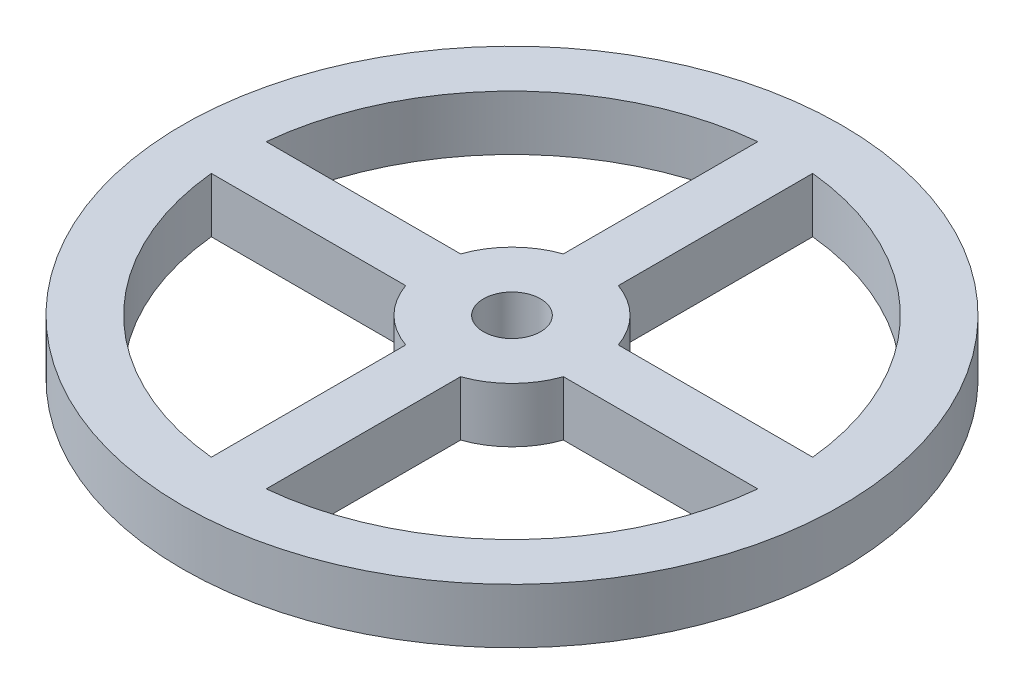
ISO-10303-21;
HEADER;
FILE_DESCRIPTION(('STEP AP214'),'2;1');
FILE_NAME('part.step','',(''),(''),'','','');
FILE_SCHEMA(('AUTOMOTIVE_DESIGN { 1 0 10303 214 1 1 1 1 }'));
ENDSEC;
DATA;
#1=APPLICATION_CONTEXT('core data for automotive mechanical design processes');
#2=APPLICATION_PROTOCOL_DEFINITION('international standard','automotive_design',2000,#1);
#3=PRODUCT_CONTEXT('',#1,'mechanical');
#4=PRODUCT('Part','Part','',(#3));
#5=PRODUCT_RELATED_PRODUCT_CATEGORY('part','',(#4));
#6=PRODUCT_DEFINITION_FORMATION('','',#4);
#7=PRODUCT_DEFINITION_CONTEXT('part definition',#1,'design');
#8=PRODUCT_DEFINITION('design','',#6,#7);
#9=PRODUCT_DEFINITION_SHAPE('','',#8);
#10=(LENGTH_UNIT() NAMED_UNIT(*) SI_UNIT(.MILLI.,.METRE.));
#11=(NAMED_UNIT(*) PLANE_ANGLE_UNIT() SI_UNIT($,.RADIAN.));
#12=(NAMED_UNIT(*) SI_UNIT($,.STERADIAN.) SOLID_ANGLE_UNIT());
#13=UNCERTAINTY_MEASURE_WITH_UNIT(LENGTH_MEASURE(1.E-05),#10,'distance_accuracy_value','');
#14=(GEOMETRIC_REPRESENTATION_CONTEXT(3) GLOBAL_UNCERTAINTY_ASSIGNED_CONTEXT((#13)) GLOBAL_UNIT_ASSIGNED_CONTEXT((#10,
#11,#12)) REPRESENTATION_CONTEXT('',''));
#15=CARTESIAN_POINT('',(0.,0.,0.));
#16=DIRECTION('',(0.,0.,1.));
#17=DIRECTION('',(1.,0.,0.));
#18=AXIS2_PLACEMENT_3D('',#15,#16,#17);
#19=CARTESIAN_POINT('',(0.,6.35,0.));
#20=DIRECTION('',(0.,1.,0.));
#21=DIRECTION('',(0.,0.,1.));
#22=AXIS2_PLACEMENT_3D('',#19,#20,#21);
#23=PLANE('',#22);
#24=CARTESIAN_POINT('',(0.,6.35,0.));
#25=DIRECTION('',(0.,1.,0.));
#26=DIRECTION('',(0.,0.,1.));
#27=AXIS2_PLACEMENT_3D('',#24,#25,#26);
#28=CIRCLE('',#27,38.1);
#29=CARTESIAN_POINT('',(0.,6.35,38.1));
#30=VERTEX_POINT('',#29);
#31=EDGE_CURVE('E11',#30,#30,#28,.T.);
#32=ORIENTED_EDGE('',*,*,#31,.T.);
#33=EDGE_LOOP('',(#32));
#34=FACE_BOUND('',#33,.T.);
#35=CARTESIAN_POINT('',(0.,6.35,0.));
#36=DIRECTION('',(0.,1.,0.));
#37=DIRECTION('',(0.,0.,1.));
#38=AXIS2_PLACEMENT_3D('',#35,#36,#37);
#39=CIRCLE('',#38,3.302);
#40=CARTESIAN_POINT('',(0.,6.35,3.302));
#41=VERTEX_POINT('',#40);
#42=EDGE_CURVE('E336',#41,#41,#39,.T.);
#43=ORIENTED_EDGE('',*,*,#42,.F.);
#44=EDGE_LOOP('',(#43));
#45=FACE_BOUND('',#44,.T.);
#46=DIRECTION('',(1.,0.,0.));
#47=VECTOR('',#46,1.);
#48=CARTESIAN_POINT('',(-31.5908511281352,6.35,-3.17499999999999));
#49=LINE('',#48,#47);
#50=CARTESIAN_POINT('',(-31.5908511281352,6.35,-3.17499999999999));
#51=VERTEX_POINT('',#50);
#52=CARTESIAN_POINT('',(-9.11484936792704,6.35,-3.175));
#53=VERTEX_POINT('',#52);
#54=EDGE_CURVE('E295',#51,#53,#49,.T.);
#55=ORIENTED_EDGE('',*,*,#54,.F.);
#56=CARTESIAN_POINT('',(0.,6.35,0.));
#57=DIRECTION('',(0.,1.,0.));
#58=DIRECTION('',(0.,0.,1.));
#59=AXIS2_PLACEMENT_3D('',#56,#57,#58);
#60=CIRCLE('',#59,31.75);
#61=CARTESIAN_POINT('',(-3.175,6.35,-31.5908511281352));
#62=VERTEX_POINT('',#61);
#63=EDGE_CURVE('E292',#62,#51,#60,.T.);
#64=ORIENTED_EDGE('',*,*,#63,.F.);
#65=DIRECTION('',(0.,0.,1.));
#66=VECTOR('',#65,1.);
#67=CARTESIAN_POINT('',(-3.175,6.35,-31.5908511281352));
#68=LINE('',#67,#66);
#69=CARTESIAN_POINT('',(-3.175,6.35,-9.11484936792704));
#70=VERTEX_POINT('',#69);
#71=EDGE_CURVE('E303',#62,#70,#68,.T.);
#72=ORIENTED_EDGE('',*,*,#71,.T.);
#73=CARTESIAN_POINT('',(0.,6.35,0.));
#74=DIRECTION('',(0.,1.,0.));
#75=DIRECTION('',(0.,0.,1.));
#76=AXIS2_PLACEMENT_3D('',#73,#74,#75);
#77=CIRCLE('',#76,9.652);
#78=EDGE_CURVE('E299',#70,#53,#77,.T.);
#79=ORIENTED_EDGE('',*,*,#78,.T.);
#80=EDGE_LOOP('',(#55,#64,#72,#79));
#81=FACE_BOUND('',#80,.T.);
#82=DIRECTION('',(0.,0.,-1.));
#83=VECTOR('',#82,1.);
#84=CARTESIAN_POINT('',(-3.17500000000033,6.35,31.5908511281352));
#85=LINE('',#84,#83);
#86=CARTESIAN_POINT('',(-3.17500000000033,6.35,31.5908511281352));
#87=VERTEX_POINT('',#86);
#88=CARTESIAN_POINT('',(-3.1750000000001,6.35,9.11484936792701));
#89=VERTEX_POINT('',#88);
#90=EDGE_CURVE('E281',#87,#89,#85,.T.);
#91=ORIENTED_EDGE('',*,*,#90,.F.);
#92=CARTESIAN_POINT('',(0.,6.35,0.));
#93=DIRECTION('',(0.,1.,0.));
#94=DIRECTION('',(1.,0.,0.));
#95=AXIS2_PLACEMENT_3D('',#92,#93,#94);
#96=CIRCLE('',#95,31.75);
#97=CARTESIAN_POINT('',(-31.5908511281352,6.35,3.17499999999967));
#98=VERTEX_POINT('',#97);
#99=EDGE_CURVE('E208',#98,#87,#96,.T.);
#100=ORIENTED_EDGE('',*,*,#99,.F.);
#101=DIRECTION('',(1.,0.,0.));
#102=VECTOR('',#101,1.);
#103=CARTESIAN_POINT('',(-31.5908511281352,6.35,3.17499999999967));
#104=LINE('',#103,#102);
#105=CARTESIAN_POINT('',(-9.11484936792708,6.35,3.1749999999999));
#106=VERTEX_POINT('',#105);
#107=EDGE_CURVE('E250',#98,#106,#104,.T.);
#108=ORIENTED_EDGE('',*,*,#107,.T.);
#109=CARTESIAN_POINT('',(0.,6.35,0.));
#110=DIRECTION('',(0.,1.,0.));
#111=DIRECTION('',(1.,0.,0.));
#112=AXIS2_PLACEMENT_3D('',#109,#110,#111);
#113=CIRCLE('',#112,9.652);
#114=EDGE_CURVE('E269',#106,#89,#113,.T.);
#115=ORIENTED_EDGE('',*,*,#114,.T.);
#116=EDGE_LOOP('',(#91,#100,#108,#115));
#117=FACE_BOUND('',#116,.T.);
#118=DIRECTION('',(-1.,0.,0.));
#119=VECTOR('',#118,1.);
#120=CARTESIAN_POINT('',(31.5908511281352,6.35,3.17499999999999));
#121=LINE('',#120,#119);
#122=CARTESIAN_POINT('',(31.5908511281352,6.35,3.17499999999999));
#123=VERTEX_POINT('',#122);
#124=CARTESIAN_POINT('',(9.11484936792704,6.35,3.175));
#125=VERTEX_POINT('',#124);
#126=EDGE_CURVE('E236',#123,#125,#121,.T.);
#127=ORIENTED_EDGE('',*,*,#126,.F.);
#128=CARTESIAN_POINT('',(0.,6.35,0.));
#129=DIRECTION('',(0.,1.,0.));
#130=DIRECTION('',(0.,0.,-1.));
#131=AXIS2_PLACEMENT_3D('',#128,#129,#130);
#132=CIRCLE('',#131,31.75);
#133=CARTESIAN_POINT('',(3.175,6.35,31.5908511281352));
#134=VERTEX_POINT('',#133);
#135=EDGE_CURVE('E166',#134,#123,#132,.T.);
#136=ORIENTED_EDGE('',*,*,#135,.F.);
#137=DIRECTION('',(0.,0.,-1.));
#138=VECTOR('',#137,1.);
#139=CARTESIAN_POINT('',(3.175,6.35,31.5908511281352));
#140=LINE('',#139,#138);
#141=CARTESIAN_POINT('',(3.175,6.35,9.11484936792704));
#142=VERTEX_POINT('',#141);
#143=EDGE_CURVE('E207',#134,#142,#140,.T.);
#144=ORIENTED_EDGE('',*,*,#143,.T.);
#145=CARTESIAN_POINT('',(0.,6.35,0.));
#146=DIRECTION('',(0.,1.,0.));
#147=DIRECTION('',(0.,0.,-1.));
#148=AXIS2_PLACEMENT_3D('',#145,#146,#147);
#149=CIRCLE('',#148,9.652);
#150=EDGE_CURVE('E63',#142,#125,#149,.T.);
#151=ORIENTED_EDGE('',*,*,#150,.T.);
#152=EDGE_LOOP('',(#127,#136,#144,#151));
#153=FACE_BOUND('',#152,.T.);
#154=DIRECTION('',(0.,0.,1.));
#155=VECTOR('',#154,1.);
#156=CARTESIAN_POINT('',(3.1750000000001,6.35,-31.5908511281352));
#157=LINE('',#156,#155);
#158=CARTESIAN_POINT('',(3.1750000000001,6.35,-31.5908511281352));
#159=VERTEX_POINT('',#158);
#160=CARTESIAN_POINT('',(3.17500000000004,6.35,-9.11484936792703));
#161=VERTEX_POINT('',#160);
#162=EDGE_CURVE('E192',#159,#161,#157,.T.);
#163=ORIENTED_EDGE('',*,*,#162,.F.);
#164=CARTESIAN_POINT('',(0.,6.35,0.));
#165=DIRECTION('',(0.,1.,0.));
#166=DIRECTION('',(-1.,0.,0.));
#167=AXIS2_PLACEMENT_3D('',#164,#165,#166);
#168=CIRCLE('',#167,31.75);
#169=CARTESIAN_POINT('',(31.5908511281352,6.35,-3.17499999999989));
#170=VERTEX_POINT('',#169);
#171=EDGE_CURVE('E199',#170,#159,#168,.T.);
#172=ORIENTED_EDGE('',*,*,#171,.F.);
#173=DIRECTION('',(-1.,0.,0.));
#174=VECTOR('',#173,1.);
#175=CARTESIAN_POINT('',(31.5908511281352,6.35,-3.17499999999989));
#176=LINE('',#175,#174);
#177=CARTESIAN_POINT('',(9.11484936792705,6.35,-3.17499999999996));
#178=VERTEX_POINT('',#177);
#179=EDGE_CURVE('E165',#170,#178,#176,.T.);
#180=ORIENTED_EDGE('',*,*,#179,.T.);
#181=CARTESIAN_POINT('',(0.,6.35,0.));
#182=DIRECTION('',(0.,1.,0.));
#183=DIRECTION('',(-1.,0.,0.));
#184=AXIS2_PLACEMENT_3D('',#181,#182,#183);
#185=CIRCLE('',#184,9.652);
#186=EDGE_CURVE('E55',#178,#161,#185,.T.);
#187=ORIENTED_EDGE('',*,*,#186,.T.);
#188=EDGE_LOOP('',(#163,#172,#180,#187));
#189=FACE_BOUND('',#188,.T.);
#190=ADVANCED_FACE('F39',(#34,#45,#81,#117,#153,#189),#23,.T.);
#191=CARTESIAN_POINT('',(0.,0.,0.));
#192=DIRECTION('',(0.,1.,0.));
#193=DIRECTION('',(0.,0.,1.));
#194=AXIS2_PLACEMENT_3D('',#191,#192,#193);
#195=PLANE('',#194);
#196=CARTESIAN_POINT('',(0.,0.,0.));
#197=DIRECTION('',(0.,1.,0.));
#198=DIRECTION('',(0.,0.,-1.));
#199=AXIS2_PLACEMENT_3D('',#196,#197,#198);
#200=CIRCLE('',#199,31.75);
#201=CARTESIAN_POINT('',(3.175,0.,31.5908511281352));
#202=VERTEX_POINT('',#201);
#203=CARTESIAN_POINT('',(31.5908511281352,0.,3.17499999999999));
#204=VERTEX_POINT('',#203);
#205=EDGE_CURVE('E240',#202,#204,#200,.T.);
#206=ORIENTED_EDGE('',*,*,#205,.T.);
#207=DIRECTION('',(-1.,0.,0.));
#208=VECTOR('',#207,1.);
#209=CARTESIAN_POINT('',(31.5908511281352,0.,3.17499999999999));
#210=LINE('',#209,#208);
#211=CARTESIAN_POINT('',(9.11484936792704,0.,3.175));
#212=VERTEX_POINT('',#211);
#213=EDGE_CURVE('E228',#204,#212,#210,.T.);
#214=ORIENTED_EDGE('',*,*,#213,.T.);
#215=CARTESIAN_POINT('',(0.,0.,0.));
#216=DIRECTION('',(0.,1.,0.));
#217=DIRECTION('',(0.,0.,-1.));
#218=AXIS2_PLACEMENT_3D('',#215,#216,#217);
#219=CIRCLE('',#218,9.652);
#220=CARTESIAN_POINT('',(3.175,0.,9.11484936792704));
#221=VERTEX_POINT('',#220);
#222=EDGE_CURVE('E219',#221,#212,#219,.T.);
#223=ORIENTED_EDGE('',*,*,#222,.F.);
#224=DIRECTION('',(0.,0.,-1.));
#225=VECTOR('',#224,1.);
#226=CARTESIAN_POINT('',(3.175,0.,31.5908511281352));
#227=LINE('',#226,#225);
#228=EDGE_CURVE('E204',#202,#221,#227,.T.);
#229=ORIENTED_EDGE('',*,*,#228,.F.);
#230=EDGE_LOOP('',(#206,#214,#223,#229));
#231=FACE_BOUND('',#230,.T.);
#232=CARTESIAN_POINT('',(0.,0.,0.));
#233=DIRECTION('',(0.,1.,0.));
#234=DIRECTION('',(0.,0.,1.));
#235=AXIS2_PLACEMENT_3D('',#232,#233,#234);
#236=CIRCLE('',#235,31.75);
#237=CARTESIAN_POINT('',(-3.175,0.,-31.5908511281352));
#238=VERTEX_POINT('',#237);
#239=CARTESIAN_POINT('',(-31.5908511281352,0.,-3.17499999999999));
#240=VERTEX_POINT('',#239);
#241=EDGE_CURVE('E203',#238,#240,#236,.T.);
#242=ORIENTED_EDGE('',*,*,#241,.T.);
#243=DIRECTION('',(1.,0.,0.));
#244=VECTOR('',#243,1.);
#245=CARTESIAN_POINT('',(-31.5908511281352,0.,-3.17499999999999));
#246=LINE('',#245,#244);
#247=CARTESIAN_POINT('',(-9.11484936792704,0.,-3.175));
#248=VERTEX_POINT('',#247);
#249=EDGE_CURVE('E311',#240,#248,#246,.T.);
#250=ORIENTED_EDGE('',*,*,#249,.T.);
#251=CARTESIAN_POINT('',(0.,0.,0.));
#252=DIRECTION('',(0.,1.,0.));
#253=DIRECTION('',(0.,0.,1.));
#254=AXIS2_PLACEMENT_3D('',#251,#252,#253);
#255=CIRCLE('',#254,9.652);
#256=CARTESIAN_POINT('',(-3.175,0.,-9.11484936792704));
#257=VERTEX_POINT('',#256);
#258=EDGE_CURVE('E315',#257,#248,#255,.T.);
#259=ORIENTED_EDGE('',*,*,#258,.F.);
#260=DIRECTION('',(0.,0.,1.));
#261=VECTOR('',#260,1.);
#262=CARTESIAN_POINT('',(-3.175,0.,-31.5908511281352));
#263=LINE('',#262,#261);
#264=EDGE_CURVE('E296',#238,#257,#263,.T.);
#265=ORIENTED_EDGE('',*,*,#264,.F.);
#266=EDGE_LOOP('',(#242,#250,#259,#265));
#267=FACE_BOUND('',#266,.T.);
#268=CARTESIAN_POINT('',(0.,0.,0.));
#269=DIRECTION('',(0.,1.,0.));
#270=DIRECTION('',(0.,0.,1.));
#271=AXIS2_PLACEMENT_3D('',#268,#269,#270);
#272=CIRCLE('',#271,38.1);
#273=CARTESIAN_POINT('',(0.,0.,38.1));
#274=VERTEX_POINT('',#273);
#275=EDGE_CURVE('E43',#274,#274,#272,.T.);
#276=ORIENTED_EDGE('',*,*,#275,.F.);
#277=EDGE_LOOP('',(#276));
#278=FACE_BOUND('',#277,.T.);
#279=CARTESIAN_POINT('',(0.,0.,0.));
#280=DIRECTION('',(0.,1.,0.));
#281=DIRECTION('',(0.,0.,1.));
#282=AXIS2_PLACEMENT_3D('',#279,#280,#281);
#283=CIRCLE('',#282,3.302);
#284=CARTESIAN_POINT('',(0.,0.,3.302));
#285=VERTEX_POINT('',#284);
#286=EDGE_CURVE('E335',#285,#285,#283,.T.);
#287=ORIENTED_EDGE('',*,*,#286,.T.);
#288=EDGE_LOOP('',(#287));
#289=FACE_BOUND('',#288,.T.);
#290=CARTESIAN_POINT('',(0.,0.,0.));
#291=DIRECTION('',(0.,1.,0.));
#292=DIRECTION('',(1.,0.,0.));
#293=AXIS2_PLACEMENT_3D('',#290,#291,#292);
#294=CIRCLE('',#293,31.75);
#295=CARTESIAN_POINT('',(-31.5908511281352,0.,3.17499999999967));
#296=VERTEX_POINT('',#295);
#297=CARTESIAN_POINT('',(-3.17500000000033,0.,31.5908511281352));
#298=VERTEX_POINT('',#297);
#299=EDGE_CURVE('E285',#296,#298,#294,.T.);
#300=ORIENTED_EDGE('',*,*,#299,.T.);
#301=DIRECTION('',(0.,0.,-1.));
#302=VECTOR('',#301,1.);
#303=CARTESIAN_POINT('',(-3.17500000000033,0.,31.5908511281352));
#304=LINE('',#303,#302);
#305=CARTESIAN_POINT('',(-3.1750000000001,0.,9.11484936792701));
#306=VERTEX_POINT('',#305);
#307=EDGE_CURVE('E273',#298,#306,#304,.T.);
#308=ORIENTED_EDGE('',*,*,#307,.T.);
#309=CARTESIAN_POINT('',(0.,0.,0.));
#310=DIRECTION('',(0.,1.,0.));
#311=DIRECTION('',(1.,0.,0.));
#312=AXIS2_PLACEMENT_3D('',#309,#310,#311);
#313=CIRCLE('',#312,9.652);
#314=CARTESIAN_POINT('',(-9.11484936792708,0.,3.1749999999999));
#315=VERTEX_POINT('',#314);
#316=EDGE_CURVE('E262',#315,#306,#313,.T.);
#317=ORIENTED_EDGE('',*,*,#316,.F.);
#318=DIRECTION('',(1.,0.,0.));
#319=VECTOR('',#318,1.);
#320=CARTESIAN_POINT('',(-31.5908511281352,0.,3.17499999999967));
#321=LINE('',#320,#319);
#322=EDGE_CURVE('E247',#296,#315,#321,.T.);
#323=ORIENTED_EDGE('',*,*,#322,.F.);
#324=EDGE_LOOP('',(#300,#308,#317,#323));
#325=FACE_BOUND('',#324,.T.);
#326=CARTESIAN_POINT('',(0.,0.,0.));
#327=DIRECTION('',(0.,1.,0.));
#328=DIRECTION('',(-1.,0.,0.));
#329=AXIS2_PLACEMENT_3D('',#326,#327,#328);
#330=CIRCLE('',#329,31.75);
#331=CARTESIAN_POINT('',(31.5908511281352,0.,-3.17499999999989));
#332=VERTEX_POINT('',#331);
#333=CARTESIAN_POINT('',(3.1750000000001,0.,-31.5908511281352));
#334=VERTEX_POINT('',#333);
#335=EDGE_CURVE('E196',#332,#334,#330,.T.);
#336=ORIENTED_EDGE('',*,*,#335,.T.);
#337=DIRECTION('',(0.,0.,1.));
#338=VECTOR('',#337,1.);
#339=CARTESIAN_POINT('',(3.1750000000001,0.,-31.5908511281352));
#340=LINE('',#339,#338);
#341=CARTESIAN_POINT('',(3.17500000000004,0.,-9.11484936792703));
#342=VERTEX_POINT('',#341);
#343=EDGE_CURVE('E175',#334,#342,#340,.T.);
#344=ORIENTED_EDGE('',*,*,#343,.T.);
#345=CARTESIAN_POINT('',(0.,0.,0.));
#346=DIRECTION('',(0.,1.,0.));
#347=DIRECTION('',(-1.,0.,0.));
#348=AXIS2_PLACEMENT_3D('',#345,#346,#347);
#349=CIRCLE('',#348,9.652);
#350=CARTESIAN_POINT('',(9.11484936792705,0.,-3.17499999999996));
#351=VERTEX_POINT('',#350);
#352=EDGE_CURVE('E169',#351,#342,#349,.T.);
#353=ORIENTED_EDGE('',*,*,#352,.F.);
#354=DIRECTION('',(-1.,0.,0.));
#355=VECTOR('',#354,1.);
#356=CARTESIAN_POINT('',(31.5908511281352,0.,-3.17499999999989));
#357=LINE('',#356,#355);
#358=EDGE_CURVE('E155',#332,#351,#357,.T.);
#359=ORIENTED_EDGE('',*,*,#358,.F.);
#360=EDGE_LOOP('',(#336,#344,#353,#359));
#361=FACE_BOUND('',#360,.T.);
#362=ADVANCED_FACE('F174',(#231,#267,#278,#289,#325,#361),#195,.F.);
#363=CARTESIAN_POINT('',(0.,6.35,0.));
#364=DIRECTION('',(0.,-1.,0.));
#365=DIRECTION('',(0.,0.,-1.));
#366=AXIS2_PLACEMENT_3D('',#363,#364,#365);
#367=CYLINDRICAL_SURFACE('',#366,38.1);
#368=ORIENTED_EDGE('',*,*,#31,.F.);
#369=EDGE_LOOP('',(#368));
#370=FACE_BOUND('',#369,.T.);
#371=ORIENTED_EDGE('',*,*,#275,.T.);
#372=EDGE_LOOP('',(#371));
#373=FACE_BOUND('',#372,.T.);
#374=ADVANCED_FACE('F41',(#370,#373),#367,.T.);
#375=CARTESIAN_POINT('',(0.,6.35,0.));
#376=DIRECTION('',(0.,-1.,0.));
#377=DIRECTION('',(0.,0.,-1.));
#378=AXIS2_PLACEMENT_3D('',#375,#376,#377);
#379=CYLINDRICAL_SURFACE('',#378,3.302);
#380=ORIENTED_EDGE('',*,*,#42,.T.);
#381=EDGE_LOOP('',(#380));
#382=FACE_BOUND('',#381,.T.);
#383=ORIENTED_EDGE('',*,*,#286,.F.);
#384=EDGE_LOOP('',(#383));
#385=FACE_BOUND('',#384,.T.);
#386=ADVANCED_FACE('F346',(#382,#385),#379,.F.);
#387=CARTESIAN_POINT('',(0.,6.35,0.));
#388=DIRECTION('',(0.,-1.,0.));
#389=DIRECTION('',(0.,0.,-1.));
#390=AXIS2_PLACEMENT_3D('',#387,#388,#389);
#391=CYLINDRICAL_SURFACE('',#390,31.75);
#392=ORIENTED_EDGE('',*,*,#241,.F.);
#393=DIRECTION('',(0.,-1.,0.));
#394=VECTOR('',#393,1.);
#395=CARTESIAN_POINT('',(-3.175,6.35,-31.5908511281352));
#396=LINE('',#395,#394);
#397=EDGE_CURVE('E307',#62,#238,#396,.T.);
#398=ORIENTED_EDGE('',*,*,#397,.F.);
#399=ORIENTED_EDGE('',*,*,#63,.T.);
#400=DIRECTION('',(0.,-1.,0.));
#401=VECTOR('',#400,1.);
#402=CARTESIAN_POINT('',(-31.5908511281352,6.35,-3.17499999999999));
#403=LINE('',#402,#401);
#404=EDGE_CURVE('E331',#51,#240,#403,.T.);
#405=ORIENTED_EDGE('',*,*,#404,.T.);
#406=EDGE_LOOP('',(#392,#398,#399,#405));
#407=FACE_BOUND('',#406,.T.);
#408=ADVANCED_FACE('F348',(#407),#391,.F.);
#409=CARTESIAN_POINT('',(-31.5908511281352,6.35,-3.17499999999999));
#410=DIRECTION('',(0.,0.,-1.));
#411=DIRECTION('',(-1.,0.,0.));
#412=AXIS2_PLACEMENT_3D('',#409,#410,#411);
#413=PLANE('',#412);
#414=ORIENTED_EDGE('',*,*,#249,.F.);
#415=ORIENTED_EDGE('',*,*,#404,.F.);
#416=ORIENTED_EDGE('',*,*,#54,.T.);
#417=DIRECTION('',(0.,-1.,0.));
#418=VECTOR('',#417,1.);
#419=CARTESIAN_POINT('',(-9.11484936792704,6.35,-3.175));
#420=LINE('',#419,#418);
#421=EDGE_CURVE('E328',#53,#248,#420,.T.);
#422=ORIENTED_EDGE('',*,*,#421,.T.);
#423=EDGE_LOOP('',(#414,#415,#416,#422));
#424=FACE_BOUND('',#423,.T.);
#425=ADVANCED_FACE('F355',(#424),#413,.T.);
#426=CARTESIAN_POINT('',(0.,6.35,0.));
#427=DIRECTION('',(0.,-1.,0.));
#428=DIRECTION('',(0.,0.,-1.));
#429=AXIS2_PLACEMENT_3D('',#426,#427,#428);
#430=CYLINDRICAL_SURFACE('',#429,9.652);
#431=ORIENTED_EDGE('',*,*,#258,.T.);
#432=ORIENTED_EDGE('',*,*,#421,.F.);
#433=ORIENTED_EDGE('',*,*,#78,.F.);
#434=DIRECTION('',(0.,-1.,0.));
#435=VECTOR('',#434,1.);
#436=CARTESIAN_POINT('',(-3.175,6.35,-9.11484936792704));
#437=LINE('',#436,#435);
#438=EDGE_CURVE('E325',#70,#257,#437,.T.);
#439=ORIENTED_EDGE('',*,*,#438,.T.);
#440=EDGE_LOOP('',(#431,#432,#433,#439));
#441=FACE_BOUND('',#440,.T.);
#442=ADVANCED_FACE('F427',(#441),#430,.T.);
#443=CARTESIAN_POINT('',(-3.175,6.35,-31.5908511281352));
#444=DIRECTION('',(1.,0.,0.));
#445=DIRECTION('',(0.,0.,-1.));
#446=AXIS2_PLACEMENT_3D('',#443,#444,#445);
#447=PLANE('',#446);
#448=ORIENTED_EDGE('',*,*,#264,.T.);
#449=ORIENTED_EDGE('',*,*,#438,.F.);
#450=ORIENTED_EDGE('',*,*,#71,.F.);
#451=ORIENTED_EDGE('',*,*,#397,.T.);
#452=EDGE_LOOP('',(#448,#449,#450,#451));
#453=FACE_BOUND('',#452,.T.);
#454=ADVANCED_FACE('F423',(#453),#447,.F.);
#455=CARTESIAN_POINT('',(0.,6.35,0.));
#456=DIRECTION('',(0.,-1.,0.));
#457=DIRECTION('',(-1.,0.,0.));
#458=AXIS2_PLACEMENT_3D('',#455,#456,#457);
#459=CYLINDRICAL_SURFACE('',#458,31.75);
#460=ORIENTED_EDGE('',*,*,#299,.F.);
#461=DIRECTION('',(0.,-1.,0.));
#462=VECTOR('',#461,1.);
#463=CARTESIAN_POINT('',(-31.5908511281352,6.35,3.17499999999967));
#464=LINE('',#463,#462);
#465=EDGE_CURVE('E258',#98,#296,#464,.T.);
#466=ORIENTED_EDGE('',*,*,#465,.F.);
#467=ORIENTED_EDGE('',*,*,#99,.T.);
#468=DIRECTION('',(0.,-1.,0.));
#469=VECTOR('',#468,1.);
#470=CARTESIAN_POINT('',(-3.17500000000033,6.35,31.5908511281352));
#471=LINE('',#470,#469);
#472=EDGE_CURVE('E277',#87,#298,#471,.T.);
#473=ORIENTED_EDGE('',*,*,#472,.T.);
#474=EDGE_LOOP('',(#460,#466,#467,#473));
#475=FACE_BOUND('',#474,.T.);
#476=ADVANCED_FACE('F419',(#475),#459,.F.);
#477=CARTESIAN_POINT('',(-3.17500000000033,6.35,31.5908511281352));
#478=DIRECTION('',(-1.,0.,0.));
#479=DIRECTION('',(0.,0.,1.));
#480=AXIS2_PLACEMENT_3D('',#477,#478,#479);
#481=PLANE('',#480);
#482=ORIENTED_EDGE('',*,*,#307,.F.);
#483=ORIENTED_EDGE('',*,*,#472,.F.);
#484=ORIENTED_EDGE('',*,*,#90,.T.);
#485=DIRECTION('',(0.,-1.,0.));
#486=VECTOR('',#485,1.);
#487=CARTESIAN_POINT('',(-3.1750000000001,6.35,9.11484936792701));
#488=LINE('',#487,#486);
#489=EDGE_CURVE('E265',#89,#306,#488,.T.);
#490=ORIENTED_EDGE('',*,*,#489,.T.);
#491=EDGE_LOOP('',(#482,#483,#484,#490));
#492=FACE_BOUND('',#491,.T.);
#493=ADVANCED_FACE('F415',(#492),#481,.T.);
#494=CARTESIAN_POINT('',(0.,6.35,0.));
#495=DIRECTION('',(0.,-1.,0.));
#496=DIRECTION('',(-1.,0.,0.));
#497=AXIS2_PLACEMENT_3D('',#494,#495,#496);
#498=CYLINDRICAL_SURFACE('',#497,9.652);
#499=ORIENTED_EDGE('',*,*,#316,.T.);
#500=ORIENTED_EDGE('',*,*,#489,.F.);
#501=ORIENTED_EDGE('',*,*,#114,.F.);
#502=DIRECTION('',(0.,-1.,0.));
#503=VECTOR('',#502,1.);
#504=CARTESIAN_POINT('',(-9.11484936792708,6.35,3.1749999999999));
#505=LINE('',#504,#503);
#506=EDGE_CURVE('E254',#106,#315,#505,.T.);
#507=ORIENTED_EDGE('',*,*,#506,.T.);
#508=EDGE_LOOP('',(#499,#500,#501,#507));
#509=FACE_BOUND('',#508,.T.);
#510=ADVANCED_FACE('F411',(#509),#498,.T.);
#511=CARTESIAN_POINT('',(-31.5908511281352,6.35,3.17499999999967));
#512=DIRECTION('',(0.,0.,-1.));
#513=DIRECTION('',(-1.,0.,0.));
#514=AXIS2_PLACEMENT_3D('',#511,#512,#513);
#515=PLANE('',#514);
#516=ORIENTED_EDGE('',*,*,#322,.T.);
#517=ORIENTED_EDGE('',*,*,#506,.F.);
#518=ORIENTED_EDGE('',*,*,#107,.F.);
#519=ORIENTED_EDGE('',*,*,#465,.T.);
#520=EDGE_LOOP('',(#516,#517,#518,#519));
#521=FACE_BOUND('',#520,.T.);
#522=ADVANCED_FACE('F407',(#521),#515,.F.);
#523=CARTESIAN_POINT('',(0.,6.35,0.));
#524=DIRECTION('',(0.,-1.,0.));
#525=DIRECTION('',(0.,0.,1.));
#526=AXIS2_PLACEMENT_3D('',#523,#524,#525);
#527=CYLINDRICAL_SURFACE('',#526,31.75);
#528=ORIENTED_EDGE('',*,*,#205,.F.);
#529=DIRECTION('',(0.,-1.,0.));
#530=VECTOR('',#529,1.);
#531=CARTESIAN_POINT('',(3.175,6.35,31.5908511281352));
#532=LINE('',#531,#530);
#533=EDGE_CURVE('E215',#134,#202,#532,.T.);
#534=ORIENTED_EDGE('',*,*,#533,.F.);
#535=ORIENTED_EDGE('',*,*,#135,.T.);
#536=DIRECTION('',(0.,-1.,0.));
#537=VECTOR('',#536,1.);
#538=CARTESIAN_POINT('',(31.5908511281352,6.35,3.17499999999999));
#539=LINE('',#538,#537);
#540=EDGE_CURVE('E232',#123,#204,#539,.T.);
#541=ORIENTED_EDGE('',*,*,#540,.T.);
#542=EDGE_LOOP('',(#528,#534,#535,#541));
#543=FACE_BOUND('',#542,.T.);
#544=ADVANCED_FACE('F403',(#543),#527,.F.);
#545=CARTESIAN_POINT('',(31.5908511281352,6.35,3.17499999999999));
#546=DIRECTION('',(0.,0.,1.));
#547=DIRECTION('',(1.,0.,0.));
#548=AXIS2_PLACEMENT_3D('',#545,#546,#547);
#549=PLANE('',#548);
#550=ORIENTED_EDGE('',*,*,#213,.F.);
#551=ORIENTED_EDGE('',*,*,#540,.F.);
#552=ORIENTED_EDGE('',*,*,#126,.T.);
#553=DIRECTION('',(0.,-1.,0.));
#554=VECTOR('',#553,1.);
#555=CARTESIAN_POINT('',(9.11484936792704,6.35,3.175));
#556=LINE('',#555,#554);
#557=EDGE_CURVE('E222',#125,#212,#556,.T.);
#558=ORIENTED_EDGE('',*,*,#557,.T.);
#559=EDGE_LOOP('',(#550,#551,#552,#558));
#560=FACE_BOUND('',#559,.T.);
#561=ADVANCED_FACE('F400',(#560),#549,.T.);
#562=CARTESIAN_POINT('',(0.,6.35,0.));
#563=DIRECTION('',(0.,-1.,0.));
#564=DIRECTION('',(0.,0.,1.));
#565=AXIS2_PLACEMENT_3D('',#562,#563,#564);
#566=CYLINDRICAL_SURFACE('',#565,9.652);
#567=ORIENTED_EDGE('',*,*,#222,.T.);
#568=ORIENTED_EDGE('',*,*,#557,.F.);
#569=ORIENTED_EDGE('',*,*,#150,.F.);
#570=DIRECTION('',(0.,-1.,0.));
#571=VECTOR('',#570,1.);
#572=CARTESIAN_POINT('',(3.175,6.35,9.11484936792704));
#573=LINE('',#572,#571);
#574=EDGE_CURVE('E212',#142,#221,#573,.T.);
#575=ORIENTED_EDGE('',*,*,#574,.T.);
#576=EDGE_LOOP('',(#567,#568,#569,#575));
#577=FACE_BOUND('',#576,.T.);
#578=ADVANCED_FACE('F393',(#577),#566,.T.);
#579=CARTESIAN_POINT('',(3.175,6.35,31.5908511281352));
#580=DIRECTION('',(-1.,0.,0.));
#581=DIRECTION('',(0.,0.,1.));
#582=AXIS2_PLACEMENT_3D('',#579,#580,#581);
#583=PLANE('',#582);
#584=ORIENTED_EDGE('',*,*,#228,.T.);
#585=ORIENTED_EDGE('',*,*,#574,.F.);
#586=ORIENTED_EDGE('',*,*,#143,.F.);
#587=ORIENTED_EDGE('',*,*,#533,.T.);
#588=EDGE_LOOP('',(#584,#585,#586,#587));
#589=FACE_BOUND('',#588,.T.);
#590=ADVANCED_FACE('F386',(#589),#583,.F.);
#591=CARTESIAN_POINT('',(0.,6.35,0.));
#592=DIRECTION('',(0.,-1.,0.));
#593=DIRECTION('',(1.,0.,0.));
#594=AXIS2_PLACEMENT_3D('',#591,#592,#593);
#595=CYLINDRICAL_SURFACE('',#594,31.75);
#596=ORIENTED_EDGE('',*,*,#335,.F.);
#597=DIRECTION('',(0.,-1.,0.));
#598=VECTOR('',#597,1.);
#599=CARTESIAN_POINT('',(31.5908511281352,6.35,-3.17499999999989));
#600=LINE('',#599,#598);
#601=EDGE_CURVE('E160',#170,#332,#600,.T.);
#602=ORIENTED_EDGE('',*,*,#601,.F.);
#603=ORIENTED_EDGE('',*,*,#171,.T.);
#604=DIRECTION('',(0.,-1.,0.));
#605=VECTOR('',#604,1.);
#606=CARTESIAN_POINT('',(3.1750000000001,6.35,-31.5908511281352));
#607=LINE('',#606,#605);
#608=EDGE_CURVE('E188',#159,#334,#607,.T.);
#609=ORIENTED_EDGE('',*,*,#608,.T.);
#610=EDGE_LOOP('',(#596,#602,#603,#609));
#611=FACE_BOUND('',#610,.T.);
#612=ADVANCED_FACE('F384',(#611),#595,.F.);
#613=CARTESIAN_POINT('',(3.1750000000001,6.35,-31.5908511281352));
#614=DIRECTION('',(1.,0.,0.));
#615=DIRECTION('',(0.,0.,-1.));
#616=AXIS2_PLACEMENT_3D('',#613,#614,#615);
#617=PLANE('',#616);
#618=ORIENTED_EDGE('',*,*,#343,.F.);
#619=ORIENTED_EDGE('',*,*,#608,.F.);
#620=ORIENTED_EDGE('',*,*,#162,.T.);
#621=DIRECTION('',(0.,-1.,0.));
#622=VECTOR('',#621,1.);
#623=CARTESIAN_POINT('',(3.17500000000004,6.35,-9.11484936792703));
#624=LINE('',#623,#622);
#625=EDGE_CURVE('E177',#161,#342,#624,.T.);
#626=ORIENTED_EDGE('',*,*,#625,.T.);
#627=EDGE_LOOP('',(#618,#619,#620,#626));
#628=FACE_BOUND('',#627,.T.);
#629=ADVANCED_FACE('F382',(#628),#617,.T.);
#630=CARTESIAN_POINT('',(0.,6.35,0.));
#631=DIRECTION('',(0.,-1.,0.));
#632=DIRECTION('',(1.,0.,0.));
#633=AXIS2_PLACEMENT_3D('',#630,#631,#632);
#634=CYLINDRICAL_SURFACE('',#633,9.652);
#635=ORIENTED_EDGE('',*,*,#352,.T.);
#636=ORIENTED_EDGE('',*,*,#625,.F.);
#637=ORIENTED_EDGE('',*,*,#186,.F.);
#638=DIRECTION('',(0.,-1.,0.));
#639=VECTOR('',#638,1.);
#640=CARTESIAN_POINT('',(9.11484936792705,6.35,-3.17499999999996));
#641=LINE('',#640,#639);
#642=EDGE_CURVE('E157',#178,#351,#641,.T.);
#643=ORIENTED_EDGE('',*,*,#642,.T.);
#644=EDGE_LOOP('',(#635,#636,#637,#643));
#645=FACE_BOUND('',#644,.T.);
#646=ADVANCED_FACE('F168',(#645),#634,.T.);
#647=CARTESIAN_POINT('',(31.5908511281352,6.35,-3.17499999999989));
#648=DIRECTION('',(0.,0.,1.));
#649=DIRECTION('',(1.,0.,0.));
#650=AXIS2_PLACEMENT_3D('',#647,#648,#649);
#651=PLANE('',#650);
#652=ORIENTED_EDGE('',*,*,#358,.T.);
#653=ORIENTED_EDGE('',*,*,#642,.F.);
#654=ORIENTED_EDGE('',*,*,#179,.F.);
#655=ORIENTED_EDGE('',*,*,#601,.T.);
#656=EDGE_LOOP('',(#652,#653,#654,#655));
#657=FACE_BOUND('',#656,.T.);
#658=ADVANCED_FACE('F156',(#657),#651,.F.);
#659=CLOSED_SHELL('',(#190,#362,#374,#386,#408,#425,#442,#454,#476,#493,#510,#522,#544,#561,
#578,#590,#612,#629,#646,#658));
#660=MANIFOLD_SOLID_BREP('B2',#659);
#661=ADVANCED_BREP_SHAPE_REPRESENTATION('',(#18,#660),#14);
#662=SHAPE_DEFINITION_REPRESENTATION(#9,#661);
ENDSEC;
END-ISO-10303-21;
